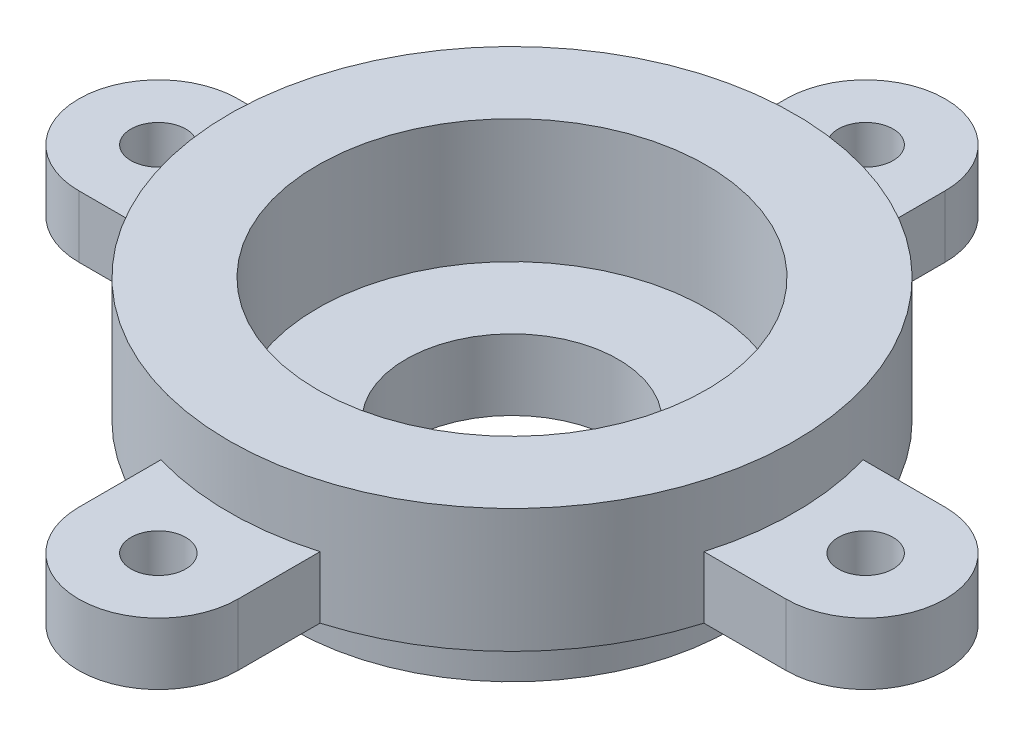
ISO-10303-21;
HEADER;
FILE_DESCRIPTION(('STEP AP214'),'2;1');
FILE_NAME('part.step','',(''),(''),'','','');
FILE_SCHEMA(('AUTOMOTIVE_DESIGN { 1 0 10303 214 1 1 1 1 }'));
ENDSEC;
DATA;
#1=APPLICATION_CONTEXT('core data for automotive mechanical design processes');
#2=APPLICATION_PROTOCOL_DEFINITION('international standard','automotive_design',2000,#1);
#3=PRODUCT_CONTEXT('',#1,'mechanical');
#4=PRODUCT('Part','Part','',(#3));
#5=PRODUCT_RELATED_PRODUCT_CATEGORY('part','',(#4));
#6=PRODUCT_DEFINITION_FORMATION('','',#4);
#7=PRODUCT_DEFINITION_CONTEXT('part definition',#1,'design');
#8=PRODUCT_DEFINITION('design','',#6,#7);
#9=PRODUCT_DEFINITION_SHAPE('','',#8);
#10=(LENGTH_UNIT() NAMED_UNIT(*) SI_UNIT(.MILLI.,.METRE.));
#11=(NAMED_UNIT(*) PLANE_ANGLE_UNIT() SI_UNIT($,.RADIAN.));
#12=(NAMED_UNIT(*) SI_UNIT($,.STERADIAN.) SOLID_ANGLE_UNIT());
#13=UNCERTAINTY_MEASURE_WITH_UNIT(LENGTH_MEASURE(1.E-05),#10,'distance_accuracy_value','');
#14=(GEOMETRIC_REPRESENTATION_CONTEXT(3) GLOBAL_UNCERTAINTY_ASSIGNED_CONTEXT((#13)) GLOBAL_UNIT_ASSIGNED_CONTEXT((#10,
#11,#12)) REPRESENTATION_CONTEXT('',''));
#15=CARTESIAN_POINT('',(0.,0.,0.));
#16=DIRECTION('',(0.,0.,1.));
#17=DIRECTION('',(1.,0.,0.));
#18=AXIS2_PLACEMENT_3D('',#15,#16,#17);
#19=CARTESIAN_POINT('',(0.,11.,0.));
#20=DIRECTION('',(0.,-1.,0.));
#21=DIRECTION('',(0.,0.,-1.));
#22=AXIS2_PLACEMENT_3D('',#19,#20,#21);
#23=CYLINDRICAL_SURFACE('',#22,16.);
#24=CARTESIAN_POINT('',(0.,11.,0.));
#25=DIRECTION('',(0.,1.,0.));
#26=DIRECTION('',(0.,0.,1.));
#27=AXIS2_PLACEMENT_3D('',#24,#25,#26);
#28=CIRCLE('',#27,16.);
#29=CARTESIAN_POINT('',(0.,11.,16.));
#30=VERTEX_POINT('',#29);
#31=EDGE_CURVE('E287',#30,#30,#28,.T.);
#32=ORIENTED_EDGE('',*,*,#31,.F.);
#33=EDGE_LOOP('',(#32));
#34=FACE_BOUND('',#33,.T.);
#35=DIRECTION('',(0.,-1.,0.));
#36=VECTOR('',#35,1.);
#37=CARTESIAN_POINT('',(-15.354152532784,7.5,-4.50000000000016));
#38=LINE('',#37,#36);
#39=CARTESIAN_POINT('',(-15.354152532784,7.5,-4.50000000000016));
#40=VERTEX_POINT('',#39);
#41=CARTESIAN_POINT('',(-15.354152532784,4.,-4.50000000000016));
#42=VERTEX_POINT('',#41);
#43=EDGE_CURVE('E47',#40,#42,#38,.T.);
#44=ORIENTED_EDGE('',*,*,#43,.F.);
#45=CARTESIAN_POINT('',(0.,7.5,0.));
#46=DIRECTION('',(0.,1.,0.));
#47=DIRECTION('',(0.,0.,1.));
#48=AXIS2_PLACEMENT_3D('',#45,#46,#47);
#49=CIRCLE('',#48,16.);
#50=CARTESIAN_POINT('',(-15.3541525327841,7.5,4.49999999999984));
#51=VERTEX_POINT('',#50);
#52=EDGE_CURVE('E52',#40,#51,#49,.T.);
#53=ORIENTED_EDGE('',*,*,#52,.T.);
#54=DIRECTION('',(0.,-1.,0.));
#55=VECTOR('',#54,1.);
#56=CARTESIAN_POINT('',(-15.3541525327841,7.5,4.49999999999984));
#57=LINE('',#56,#55);
#58=CARTESIAN_POINT('',(-15.3541525327841,4.,4.49999999999984));
#59=VERTEX_POINT('',#58);
#60=EDGE_CURVE('E165',#51,#59,#57,.T.);
#61=ORIENTED_EDGE('',*,*,#60,.T.);
#62=CARTESIAN_POINT('',(0.,4.,0.));
#63=DIRECTION('',(0.,1.,0.));
#64=DIRECTION('',(0.,0.,1.));
#65=AXIS2_PLACEMENT_3D('',#62,#63,#64);
#66=CIRCLE('',#65,16.);
#67=CARTESIAN_POINT('',(-4.5,4.,15.3541525327841));
#68=VERTEX_POINT('',#67);
#69=EDGE_CURVE('E293',#59,#68,#66,.T.);
#70=ORIENTED_EDGE('',*,*,#69,.T.);
#71=DIRECTION('',(0.,-1.,0.));
#72=VECTOR('',#71,1.);
#73=CARTESIAN_POINT('',(-4.5,7.5,15.3541525327841));
#74=LINE('',#73,#72);
#75=CARTESIAN_POINT('',(-4.5,7.5,15.3541525327841));
#76=VERTEX_POINT('',#75);
#77=EDGE_CURVE('E205',#76,#68,#74,.T.);
#78=ORIENTED_EDGE('',*,*,#77,.F.);
#79=CARTESIAN_POINT('',(0.,7.5,0.));
#80=DIRECTION('',(0.,1.,0.));
#81=DIRECTION('',(0.,0.,1.));
#82=AXIS2_PLACEMENT_3D('',#79,#80,#81);
#83=CIRCLE('',#82,16.);
#84=CARTESIAN_POINT('',(4.5,7.5,15.3541525327841));
#85=VERTEX_POINT('',#84);
#86=EDGE_CURVE('E189',#76,#85,#83,.T.);
#87=ORIENTED_EDGE('',*,*,#86,.T.);
#88=DIRECTION('',(0.,-1.,0.));
#89=VECTOR('',#88,1.);
#90=CARTESIAN_POINT('',(4.5,7.5,15.3541525327841));
#91=LINE('',#90,#89);
#92=CARTESIAN_POINT('',(4.5,4.,15.3541525327841));
#93=VERTEX_POINT('',#92);
#94=EDGE_CURVE('E199',#85,#93,#91,.T.);
#95=ORIENTED_EDGE('',*,*,#94,.T.);
#96=CARTESIAN_POINT('',(15.3541525327841,4.,4.50000000000005));
#97=VERTEX_POINT('',#96);
#98=EDGE_CURVE('E604',#93,#97,#66,.T.);
#99=ORIENTED_EDGE('',*,*,#98,.T.);
#100=DIRECTION('',(0.,-1.,0.));
#101=VECTOR('',#100,1.);
#102=CARTESIAN_POINT('',(15.3541525327841,7.5,4.50000000000005));
#103=LINE('',#102,#101);
#104=CARTESIAN_POINT('',(15.3541525327841,7.5,4.50000000000005));
#105=VERTEX_POINT('',#104);
#106=EDGE_CURVE('E239',#105,#97,#103,.T.);
#107=ORIENTED_EDGE('',*,*,#106,.F.);
#108=CARTESIAN_POINT('',(0.,7.5,0.));
#109=DIRECTION('',(0.,1.,0.));
#110=DIRECTION('',(0.,0.,1.));
#111=AXIS2_PLACEMENT_3D('',#108,#109,#110);
#112=CIRCLE('',#111,16.);
#113=CARTESIAN_POINT('',(15.3541525327841,7.5,-4.49999999999995));
#114=VERTEX_POINT('',#113);
#115=EDGE_CURVE('E223',#105,#114,#112,.T.);
#116=ORIENTED_EDGE('',*,*,#115,.T.);
#117=DIRECTION('',(0.,-1.,0.));
#118=VECTOR('',#117,1.);
#119=CARTESIAN_POINT('',(15.3541525327841,7.5,-4.49999999999995));
#120=LINE('',#119,#118);
#121=CARTESIAN_POINT('',(15.3541525327841,4.,-4.49999999999995));
#122=VERTEX_POINT('',#121);
#123=EDGE_CURVE('E233',#114,#122,#120,.T.);
#124=ORIENTED_EDGE('',*,*,#123,.T.);
#125=CARTESIAN_POINT('',(4.5,4.,-15.3541525327841));
#126=VERTEX_POINT('',#125);
#127=EDGE_CURVE('E286',#122,#126,#66,.T.);
#128=ORIENTED_EDGE('',*,*,#127,.T.);
#129=DIRECTION('',(0.,-1.,0.));
#130=VECTOR('',#129,1.);
#131=CARTESIAN_POINT('',(4.5,7.5,-15.3541525327841));
#132=LINE('',#131,#130);
#133=CARTESIAN_POINT('',(4.5,7.5,-15.3541525327841));
#134=VERTEX_POINT('',#133);
#135=EDGE_CURVE('E273',#134,#126,#132,.T.);
#136=ORIENTED_EDGE('',*,*,#135,.F.);
#137=CARTESIAN_POINT('',(0.,7.5,0.));
#138=DIRECTION('',(0.,1.,0.));
#139=DIRECTION('',(0.,0.,1.));
#140=AXIS2_PLACEMENT_3D('',#137,#138,#139);
#141=CIRCLE('',#140,16.);
#142=CARTESIAN_POINT('',(-4.5,7.5,-15.3541525327841));
#143=VERTEX_POINT('',#142);
#144=EDGE_CURVE('E257',#134,#143,#141,.T.);
#145=ORIENTED_EDGE('',*,*,#144,.T.);
#146=DIRECTION('',(0.,-1.,0.));
#147=VECTOR('',#146,1.);
#148=CARTESIAN_POINT('',(-4.5,7.5,-15.3541525327841));
#149=LINE('',#148,#147);
#150=CARTESIAN_POINT('',(-4.5,4.,-15.3541525327841));
#151=VERTEX_POINT('',#150);
#152=EDGE_CURVE('E267',#143,#151,#149,.T.);
#153=ORIENTED_EDGE('',*,*,#152,.T.);
#154=EDGE_CURVE('E291',#151,#42,#66,.T.);
#155=ORIENTED_EDGE('',*,*,#154,.T.);
#156=EDGE_LOOP('',(#44,#53,#61,#70,#78,#87,#95,#99,#107,#116,#124,#128,#136,#145,#153,#155));
#157=FACE_BOUND('',#156,.T.);
#158=ADVANCED_FACE('F32',(#34,#157),#23,.T.);
#159=CARTESIAN_POINT('',(0.,4.,0.));
#160=DIRECTION('',(0.,1.,0.));
#161=DIRECTION('',(0.,0.,1.));
#162=AXIS2_PLACEMENT_3D('',#159,#160,#161);
#163=PLANE('',#162);
#164=CARTESIAN_POINT('',(0.,4.,0.));
#165=DIRECTION('',(0.,1.,0.));
#166=DIRECTION('',(0.,0.,1.));
#167=AXIS2_PLACEMENT_3D('',#164,#165,#166);
#168=CIRCLE('',#167,6.);
#169=CARTESIAN_POINT('',(0.,4.,6.));
#170=VERTEX_POINT('',#169);
#171=EDGE_CURVE('E294',#170,#170,#168,.T.);
#172=ORIENTED_EDGE('',*,*,#171,.F.);
#173=EDGE_LOOP('',(#172));
#174=FACE_BOUND('',#173,.T.);
#175=CARTESIAN_POINT('',(0.,4.,0.));
#176=DIRECTION('',(0.,1.,0.));
#177=DIRECTION('',(0.,0.,1.));
#178=AXIS2_PLACEMENT_3D('',#175,#176,#177);
#179=CIRCLE('',#178,11.);
#180=CARTESIAN_POINT('',(0.,4.,11.));
#181=VERTEX_POINT('',#180);
#182=EDGE_CURVE('E11',#181,#181,#179,.F.);
#183=ORIENTED_EDGE('',*,*,#182,.F.);
#184=EDGE_LOOP('',(#183));
#185=FACE_BOUND('',#184,.T.);
#186=ADVANCED_FACE('F308',(#174,#185),#163,.T.);
#187=CARTESIAN_POINT('',(0.,0.,0.));
#188=DIRECTION('',(0.,1.,0.));
#189=DIRECTION('',(0.,0.,1.));
#190=AXIS2_PLACEMENT_3D('',#187,#188,#189);
#191=PLANE('',#190);
#192=CARTESIAN_POINT('',(0.,0.,0.));
#193=DIRECTION('',(0.,1.,0.));
#194=DIRECTION('',(0.,0.,1.));
#195=AXIS2_PLACEMENT_3D('',#192,#193,#194);
#196=CIRCLE('',#195,12.45);
#197=CARTESIAN_POINT('',(0.,0.,12.45));
#198=VERTEX_POINT('',#197);
#199=EDGE_CURVE('E297',#198,#198,#196,.T.);
#200=ORIENTED_EDGE('',*,*,#199,.F.);
#201=EDGE_LOOP('',(#200));
#202=FACE_BOUND('',#201,.T.);
#203=CARTESIAN_POINT('',(0.,0.,0.));
#204=DIRECTION('',(0.,1.,0.));
#205=DIRECTION('',(0.,0.,1.));
#206=AXIS2_PLACEMENT_3D('',#203,#204,#205);
#207=CIRCLE('',#206,6.);
#208=CARTESIAN_POINT('',(0.,0.,6.));
#209=VERTEX_POINT('',#208);
#210=EDGE_CURVE('E290',#209,#209,#207,.T.);
#211=ORIENTED_EDGE('',*,*,#210,.T.);
#212=EDGE_LOOP('',(#211));
#213=FACE_BOUND('',#212,.T.);
#214=ADVANCED_FACE('F305',(#202,#213),#191,.F.);
#215=CARTESIAN_POINT('',(0.,4.,0.));
#216=DIRECTION('',(0.,-1.,0.));
#217=DIRECTION('',(0.,0.,-1.));
#218=AXIS2_PLACEMENT_3D('',#215,#216,#217);
#219=CYLINDRICAL_SURFACE('',#218,12.45);
#220=CARTESIAN_POINT('',(0.,4.,0.));
#221=DIRECTION('',(0.,1.,0.));
#222=DIRECTION('',(0.,0.,1.));
#223=AXIS2_PLACEMENT_3D('',#220,#221,#222);
#224=CIRCLE('',#223,12.45);
#225=CARTESIAN_POINT('',(0.,4.,12.45));
#226=VERTEX_POINT('',#225);
#227=EDGE_CURVE('E40',#226,#226,#224,.T.);
#228=ORIENTED_EDGE('',*,*,#227,.F.);
#229=EDGE_LOOP('',(#228));
#230=FACE_BOUND('',#229,.T.);
#231=ORIENTED_EDGE('',*,*,#199,.T.);
#232=EDGE_LOOP('',(#231));
#233=FACE_BOUND('',#232,.T.);
#234=ADVANCED_FACE('F34',(#230,#233),#219,.T.);
#235=CARTESIAN_POINT('',(0.,4.,0.));
#236=DIRECTION('',(0.,-1.,0.));
#237=DIRECTION('',(0.,0.,-1.));
#238=AXIS2_PLACEMENT_3D('',#235,#236,#237);
#239=CYLINDRICAL_SURFACE('',#238,6.);
#240=ORIENTED_EDGE('',*,*,#171,.T.);
#241=EDGE_LOOP('',(#240));
#242=FACE_BOUND('',#241,.T.);
#243=ORIENTED_EDGE('',*,*,#210,.F.);
#244=EDGE_LOOP('',(#243));
#245=FACE_BOUND('',#244,.T.);
#246=ADVANCED_FACE('F311',(#242,#245),#239,.F.);
#247=CARTESIAN_POINT('',(0.,11.,0.));
#248=DIRECTION('',(0.,1.,0.));
#249=DIRECTION('',(0.,0.,1.));
#250=AXIS2_PLACEMENT_3D('',#247,#248,#249);
#251=PLANE('',#250);
#252=ORIENTED_EDGE('',*,*,#31,.T.);
#253=EDGE_LOOP('',(#252));
#254=FACE_BOUND('',#253,.T.);
#255=CARTESIAN_POINT('',(0.,11.,0.));
#256=DIRECTION('',(0.,1.,0.));
#257=DIRECTION('',(0.,0.,1.));
#258=AXIS2_PLACEMENT_3D('',#255,#256,#257);
#259=CIRCLE('',#258,11.);
#260=CARTESIAN_POINT('',(0.,11.,11.));
#261=VERTEX_POINT('',#260);
#262=EDGE_CURVE('E276',#261,#261,#259,.T.);
#263=ORIENTED_EDGE('',*,*,#262,.F.);
#264=EDGE_LOOP('',(#263));
#265=FACE_BOUND('',#264,.T.);
#266=ADVANCED_FACE('F313',(#254,#265),#251,.T.);
#267=CARTESIAN_POINT('',(0.,4.,0.));
#268=DIRECTION('',(0.,1.,0.));
#269=DIRECTION('',(0.,0.,1.));
#270=AXIS2_PLACEMENT_3D('',#267,#268,#269);
#271=PLANE('',#270);
#272=ORIENTED_EDGE('',*,*,#227,.T.);
#273=EDGE_LOOP('',(#272));
#274=FACE_BOUND('',#273,.T.);
#275=ORIENTED_EDGE('',*,*,#154,.F.);
#276=DIRECTION('',(0.,0.,1.));
#277=VECTOR('',#276,1.);
#278=CARTESIAN_POINT('',(-4.5,4.,0.));
#279=LINE('',#278,#277);
#280=CARTESIAN_POINT('',(-4.5,4.,-20.));
#281=VERTEX_POINT('',#280);
#282=EDGE_CURVE('E254',#281,#151,#279,.T.);
#283=ORIENTED_EDGE('',*,*,#282,.F.);
#284=CARTESIAN_POINT('',(0.,4.,-20.));
#285=DIRECTION('',(0.,1.,0.));
#286=DIRECTION('',(0.,0.,1.));
#287=AXIS2_PLACEMENT_3D('',#284,#285,#286);
#288=CIRCLE('',#287,4.5);
#289=CARTESIAN_POINT('',(4.5,4.,-20.));
#290=VERTEX_POINT('',#289);
#291=EDGE_CURVE('E270',#290,#281,#288,.T.);
#292=ORIENTED_EDGE('',*,*,#291,.F.);
#293=DIRECTION('',(0.,0.,-1.));
#294=VECTOR('',#293,1.);
#295=CARTESIAN_POINT('',(4.5,4.,0.));
#296=LINE('',#295,#294);
#297=EDGE_CURVE('E260',#126,#290,#296,.T.);
#298=ORIENTED_EDGE('',*,*,#297,.F.);
#299=ORIENTED_EDGE('',*,*,#127,.F.);
#300=DIRECTION('',(-1.,0.,0.));
#301=VECTOR('',#300,1.);
#302=CARTESIAN_POINT('',(0.,4.,-4.5));
#303=LINE('',#302,#301);
#304=CARTESIAN_POINT('',(20.,4.,-4.49999999999993));
#305=VERTEX_POINT('',#304);
#306=EDGE_CURVE('E220',#305,#122,#303,.T.);
#307=ORIENTED_EDGE('',*,*,#306,.F.);
#308=CARTESIAN_POINT('',(20.,4.,0.));
#309=DIRECTION('',(0.,1.,0.));
#310=DIRECTION('',(0.,0.,1.));
#311=AXIS2_PLACEMENT_3D('',#308,#309,#310);
#312=CIRCLE('',#311,4.5);
#313=CARTESIAN_POINT('',(20.,4.,4.50000000000007));
#314=VERTEX_POINT('',#313);
#315=EDGE_CURVE('E236',#314,#305,#312,.T.);
#316=ORIENTED_EDGE('',*,*,#315,.F.);
#317=DIRECTION('',(1.,0.,0.));
#318=VECTOR('',#317,1.);
#319=CARTESIAN_POINT('',(0.,4.,4.5));
#320=LINE('',#319,#318);
#321=EDGE_CURVE('E226',#97,#314,#320,.T.);
#322=ORIENTED_EDGE('',*,*,#321,.F.);
#323=ORIENTED_EDGE('',*,*,#98,.F.);
#324=DIRECTION('',(0.,0.,-1.));
#325=VECTOR('',#324,1.);
#326=CARTESIAN_POINT('',(4.5,4.,0.));
#327=LINE('',#326,#325);
#328=CARTESIAN_POINT('',(4.5,4.,20.));
#329=VERTEX_POINT('',#328);
#330=EDGE_CURVE('E186',#329,#93,#327,.T.);
#331=ORIENTED_EDGE('',*,*,#330,.F.);
#332=CARTESIAN_POINT('',(0.,4.,20.));
#333=DIRECTION('',(0.,1.,0.));
#334=DIRECTION('',(0.,0.,1.));
#335=AXIS2_PLACEMENT_3D('',#332,#333,#334);
#336=CIRCLE('',#335,4.5);
#337=CARTESIAN_POINT('',(-4.5,4.,20.));
#338=VERTEX_POINT('',#337);
#339=EDGE_CURVE('E202',#338,#329,#336,.T.);
#340=ORIENTED_EDGE('',*,*,#339,.F.);
#341=DIRECTION('',(0.,0.,1.));
#342=VECTOR('',#341,1.);
#343=CARTESIAN_POINT('',(-4.5,4.,0.));
#344=LINE('',#343,#342);
#345=EDGE_CURVE('E192',#68,#338,#344,.T.);
#346=ORIENTED_EDGE('',*,*,#345,.F.);
#347=ORIENTED_EDGE('',*,*,#69,.F.);
#348=DIRECTION('',(1.,0.,0.));
#349=VECTOR('',#348,1.);
#350=CARTESIAN_POINT('',(0.,4.,4.5));
#351=LINE('',#350,#349);
#352=CARTESIAN_POINT('',(-20.,4.,4.49999999999979));
#353=VERTEX_POINT('',#352);
#354=EDGE_CURVE('E174',#353,#59,#351,.T.);
#355=ORIENTED_EDGE('',*,*,#354,.F.);
#356=CARTESIAN_POINT('',(-20.,4.,-2.09488880330588E-13));
#357=DIRECTION('',(0.,1.,0.));
#358=DIRECTION('',(0.,0.,1.));
#359=AXIS2_PLACEMENT_3D('',#356,#357,#358);
#360=CIRCLE('',#359,4.5);
#361=CARTESIAN_POINT('',(-20.,4.,-4.50000000000021));
#362=VERTEX_POINT('',#361);
#363=EDGE_CURVE('E160',#362,#353,#360,.T.);
#364=ORIENTED_EDGE('',*,*,#363,.F.);
#365=DIRECTION('',(-1.,0.,0.));
#366=VECTOR('',#365,1.);
#367=CARTESIAN_POINT('',(0.,4.,-4.5));
#368=LINE('',#367,#366);
#369=EDGE_CURVE('E169',#42,#362,#368,.T.);
#370=ORIENTED_EDGE('',*,*,#369,.F.);
#371=EDGE_LOOP('',(#275,#283,#292,#298,#299,#307,#316,#322,#323,#331,#340,#346,#347,#355,#364,#370));
#372=FACE_BOUND('',#371,.T.);
#373=CARTESIAN_POINT('',(0.,4.,-20.));
#374=DIRECTION('',(0.,1.,0.));
#375=DIRECTION('',(0.,0.,1.));
#376=AXIS2_PLACEMENT_3D('',#373,#374,#375);
#377=CIRCLE('',#376,1.55);
#378=CARTESIAN_POINT('',(0.,4.,-18.45));
#379=VERTEX_POINT('',#378);
#380=EDGE_CURVE('E242',#379,#379,#377,.T.);
#381=ORIENTED_EDGE('',*,*,#380,.T.);
#382=EDGE_LOOP('',(#381));
#383=FACE_BOUND('',#382,.T.);
#384=CARTESIAN_POINT('',(20.,4.,0.));
#385=DIRECTION('',(0.,1.,0.));
#386=DIRECTION('',(0.,0.,1.));
#387=AXIS2_PLACEMENT_3D('',#384,#385,#386);
#388=CIRCLE('',#387,1.55);
#389=CARTESIAN_POINT('',(20.,4.,1.55000000000007));
#390=VERTEX_POINT('',#389);
#391=EDGE_CURVE('E208',#390,#390,#388,.T.);
#392=ORIENTED_EDGE('',*,*,#391,.T.);
#393=EDGE_LOOP('',(#392));
#394=FACE_BOUND('',#393,.T.);
#395=CARTESIAN_POINT('',(0.,4.,20.));
#396=DIRECTION('',(0.,1.,0.));
#397=DIRECTION('',(0.,0.,1.));
#398=AXIS2_PLACEMENT_3D('',#395,#396,#397);
#399=CIRCLE('',#398,1.55);
#400=CARTESIAN_POINT('',(0.,4.,21.55));
#401=VERTEX_POINT('',#400);
#402=EDGE_CURVE('E180',#401,#401,#399,.T.);
#403=ORIENTED_EDGE('',*,*,#402,.T.);
#404=EDGE_LOOP('',(#403));
#405=FACE_BOUND('',#404,.T.);
#406=CARTESIAN_POINT('',(-20.,4.,-2.09488880330588E-13));
#407=DIRECTION('',(0.,1.,0.));
#408=DIRECTION('',(0.,0.,1.));
#409=AXIS2_PLACEMENT_3D('',#406,#407,#408);
#410=CIRCLE('',#409,1.55);
#411=CARTESIAN_POINT('',(-20.,4.,1.54999999999979));
#412=VERTEX_POINT('',#411);
#413=EDGE_CURVE('E421',#412,#412,#410,.T.);
#414=ORIENTED_EDGE('',*,*,#413,.T.);
#415=EDGE_LOOP('',(#414));
#416=FACE_BOUND('',#415,.T.);
#417=ADVANCED_FACE('F320',(#274,#372,#383,#394,#405,#416),#271,.F.);
#418=CARTESIAN_POINT('',(0.,11.,0.));
#419=DIRECTION('',(0.,-1.,0.));
#420=DIRECTION('',(0.,0.,-1.));
#421=AXIS2_PLACEMENT_3D('',#418,#419,#420);
#422=CYLINDRICAL_SURFACE('',#421,11.);
#423=ORIENTED_EDGE('',*,*,#262,.T.);
#424=EDGE_LOOP('',(#423));
#425=FACE_BOUND('',#424,.T.);
#426=ORIENTED_EDGE('',*,*,#182,.T.);
#427=EDGE_LOOP('',(#426));
#428=FACE_BOUND('',#427,.T.);
#429=ADVANCED_FACE('F335',(#425,#428),#422,.F.);
#430=CARTESIAN_POINT('',(0.,7.5,0.));
#431=DIRECTION('',(0.,1.,0.));
#432=DIRECTION('',(0.,0.,1.));
#433=AXIS2_PLACEMENT_3D('',#430,#431,#432);
#434=PLANE('',#433);
#435=ORIENTED_EDGE('',*,*,#144,.F.);
#436=DIRECTION('',(0.,0.,-1.));
#437=VECTOR('',#436,1.);
#438=CARTESIAN_POINT('',(4.5,7.5,0.));
#439=LINE('',#438,#437);
#440=CARTESIAN_POINT('',(4.5,7.5,-20.));
#441=VERTEX_POINT('',#440);
#442=EDGE_CURVE('E265',#134,#441,#439,.T.);
#443=ORIENTED_EDGE('',*,*,#442,.T.);
#444=CARTESIAN_POINT('',(0.,7.5,-20.));
#445=DIRECTION('',(0.,1.,0.));
#446=DIRECTION('',(0.,0.,1.));
#447=AXIS2_PLACEMENT_3D('',#444,#445,#446);
#448=CIRCLE('',#447,4.5);
#449=CARTESIAN_POINT('',(-4.5,7.5,-20.));
#450=VERTEX_POINT('',#449);
#451=EDGE_CURVE('E263',#441,#450,#448,.T.);
#452=ORIENTED_EDGE('',*,*,#451,.T.);
#453=DIRECTION('',(0.,0.,1.));
#454=VECTOR('',#453,1.);
#455=CARTESIAN_POINT('',(-4.5,7.5,0.));
#456=LINE('',#455,#454);
#457=EDGE_CURVE('E259',#450,#143,#456,.T.);
#458=ORIENTED_EDGE('',*,*,#457,.T.);
#459=EDGE_LOOP('',(#435,#443,#452,#458));
#460=FACE_BOUND('',#459,.T.);
#461=CARTESIAN_POINT('',(0.,7.5,-20.));
#462=DIRECTION('',(0.,1.,0.));
#463=DIRECTION('',(0.,0.,1.));
#464=AXIS2_PLACEMENT_3D('',#461,#462,#463);
#465=CIRCLE('',#464,1.55);
#466=CARTESIAN_POINT('',(0.,7.5,-18.45));
#467=VERTEX_POINT('',#466);
#468=EDGE_CURVE('E251',#467,#467,#465,.T.);
#469=ORIENTED_EDGE('',*,*,#468,.F.);
#470=EDGE_LOOP('',(#469));
#471=FACE_BOUND('',#470,.T.);
#472=ADVANCED_FACE('F340',(#460,#471),#434,.T.);
#473=CARTESIAN_POINT('',(4.5,7.5,0.));
#474=DIRECTION('',(-1.,0.,0.));
#475=DIRECTION('',(0.,0.,1.));
#476=AXIS2_PLACEMENT_3D('',#473,#474,#475);
#477=PLANE('',#476);
#478=ORIENTED_EDGE('',*,*,#297,.T.);
#479=DIRECTION('',(0.,-1.,0.));
#480=VECTOR('',#479,1.);
#481=CARTESIAN_POINT('',(4.5,7.5,-20.));
#482=LINE('',#481,#480);
#483=EDGE_CURVE('E277',#441,#290,#482,.T.);
#484=ORIENTED_EDGE('',*,*,#483,.F.);
#485=ORIENTED_EDGE('',*,*,#442,.F.);
#486=ORIENTED_EDGE('',*,*,#135,.T.);
#487=EDGE_LOOP('',(#478,#484,#485,#486));
#488=FACE_BOUND('',#487,.T.);
#489=ADVANCED_FACE('F350',(#488),#477,.F.);
#490=CARTESIAN_POINT('',(0.,7.5,-20.));
#491=DIRECTION('',(0.,-1.,0.));
#492=DIRECTION('',(0.,0.,-1.));
#493=AXIS2_PLACEMENT_3D('',#490,#491,#492);
#494=CYLINDRICAL_SURFACE('',#493,4.5);
#495=ORIENTED_EDGE('',*,*,#291,.T.);
#496=DIRECTION('',(0.,-1.,0.));
#497=VECTOR('',#496,1.);
#498=CARTESIAN_POINT('',(-4.5,7.5,-20.));
#499=LINE('',#498,#497);
#500=EDGE_CURVE('E280',#450,#281,#499,.T.);
#501=ORIENTED_EDGE('',*,*,#500,.F.);
#502=ORIENTED_EDGE('',*,*,#451,.F.);
#503=ORIENTED_EDGE('',*,*,#483,.T.);
#504=EDGE_LOOP('',(#495,#501,#502,#503));
#505=FACE_BOUND('',#504,.T.);
#506=ADVANCED_FACE('F346',(#505),#494,.T.);
#507=CARTESIAN_POINT('',(-4.5,7.5,0.));
#508=DIRECTION('',(1.,0.,0.));
#509=DIRECTION('',(0.,0.,-1.));
#510=AXIS2_PLACEMENT_3D('',#507,#508,#509);
#511=PLANE('',#510);
#512=ORIENTED_EDGE('',*,*,#282,.T.);
#513=ORIENTED_EDGE('',*,*,#152,.F.);
#514=ORIENTED_EDGE('',*,*,#457,.F.);
#515=ORIENTED_EDGE('',*,*,#500,.T.);
#516=EDGE_LOOP('',(#512,#513,#514,#515));
#517=FACE_BOUND('',#516,.T.);
#518=ADVANCED_FACE('F342',(#517),#511,.F.);
#519=CARTESIAN_POINT('',(0.,7.5,-20.));
#520=DIRECTION('',(0.,-1.,0.));
#521=DIRECTION('',(0.,0.,-1.));
#522=AXIS2_PLACEMENT_3D('',#519,#520,#521);
#523=CYLINDRICAL_SURFACE('',#522,1.55);
#524=ORIENTED_EDGE('',*,*,#468,.T.);
#525=EDGE_LOOP('',(#524));
#526=FACE_BOUND('',#525,.T.);
#527=ORIENTED_EDGE('',*,*,#380,.F.);
#528=EDGE_LOOP('',(#527));
#529=FACE_BOUND('',#528,.T.);
#530=ADVANCED_FACE('F345',(#526,#529),#523,.F.);
#531=CARTESIAN_POINT('',(0.,7.5,0.));
#532=DIRECTION('',(0.,1.,0.));
#533=DIRECTION('',(0.,0.,1.));
#534=AXIS2_PLACEMENT_3D('',#531,#532,#533);
#535=PLANE('',#534);
#536=ORIENTED_EDGE('',*,*,#115,.F.);
#537=DIRECTION('',(1.,0.,0.));
#538=VECTOR('',#537,1.);
#539=CARTESIAN_POINT('',(0.,7.5,4.5));
#540=LINE('',#539,#538);
#541=CARTESIAN_POINT('',(20.,7.5,4.50000000000007));
#542=VERTEX_POINT('',#541);
#543=EDGE_CURVE('E231',#105,#542,#540,.T.);
#544=ORIENTED_EDGE('',*,*,#543,.T.);
#545=CARTESIAN_POINT('',(20.,7.5,0.));
#546=DIRECTION('',(0.,1.,0.));
#547=DIRECTION('',(0.,0.,1.));
#548=AXIS2_PLACEMENT_3D('',#545,#546,#547);
#549=CIRCLE('',#548,4.5);
#550=CARTESIAN_POINT('',(20.,7.5,-4.49999999999993));
#551=VERTEX_POINT('',#550);
#552=EDGE_CURVE('E229',#542,#551,#549,.T.);
#553=ORIENTED_EDGE('',*,*,#552,.T.);
#554=DIRECTION('',(-1.,0.,0.));
#555=VECTOR('',#554,1.);
#556=CARTESIAN_POINT('',(0.,7.5,-4.5));
#557=LINE('',#556,#555);
#558=EDGE_CURVE('E225',#551,#114,#557,.T.);
#559=ORIENTED_EDGE('',*,*,#558,.T.);
#560=EDGE_LOOP('',(#536,#544,#553,#559));
#561=FACE_BOUND('',#560,.T.);
#562=CARTESIAN_POINT('',(20.,7.5,0.));
#563=DIRECTION('',(0.,1.,0.));
#564=DIRECTION('',(0.,0.,1.));
#565=AXIS2_PLACEMENT_3D('',#562,#563,#564);
#566=CIRCLE('',#565,1.55);
#567=CARTESIAN_POINT('',(20.,7.5,1.55000000000007));
#568=VERTEX_POINT('',#567);
#569=EDGE_CURVE('E217',#568,#568,#566,.T.);
#570=ORIENTED_EDGE('',*,*,#569,.F.);
#571=EDGE_LOOP('',(#570));
#572=FACE_BOUND('',#571,.T.);
#573=ADVANCED_FACE('F360',(#561,#572),#535,.T.);
#574=CARTESIAN_POINT('',(0.,7.5,4.5));
#575=DIRECTION('',(0.,0.,-1.));
#576=DIRECTION('',(-1.,0.,0.));
#577=AXIS2_PLACEMENT_3D('',#574,#575,#576);
#578=PLANE('',#577);
#579=ORIENTED_EDGE('',*,*,#321,.T.);
#580=DIRECTION('',(0.,-1.,0.));
#581=VECTOR('',#580,1.);
#582=CARTESIAN_POINT('',(20.,7.5,4.50000000000007));
#583=LINE('',#582,#581);
#584=EDGE_CURVE('E243',#542,#314,#583,.T.);
#585=ORIENTED_EDGE('',*,*,#584,.F.);
#586=ORIENTED_EDGE('',*,*,#543,.F.);
#587=ORIENTED_EDGE('',*,*,#106,.T.);
#588=EDGE_LOOP('',(#579,#585,#586,#587));
#589=FACE_BOUND('',#588,.T.);
#590=ADVANCED_FACE('F370',(#589),#578,.F.);
#591=CARTESIAN_POINT('',(20.,7.5,0.));
#592=DIRECTION('',(0.,-1.,0.));
#593=DIRECTION('',(0.,0.,-1.));
#594=AXIS2_PLACEMENT_3D('',#591,#592,#593);
#595=CYLINDRICAL_SURFACE('',#594,4.5);
#596=ORIENTED_EDGE('',*,*,#315,.T.);
#597=DIRECTION('',(0.,-1.,0.));
#598=VECTOR('',#597,1.);
#599=CARTESIAN_POINT('',(20.,7.5,-4.49999999999993));
#600=LINE('',#599,#598);
#601=EDGE_CURVE('E246',#551,#305,#600,.T.);
#602=ORIENTED_EDGE('',*,*,#601,.F.);
#603=ORIENTED_EDGE('',*,*,#552,.F.);
#604=ORIENTED_EDGE('',*,*,#584,.T.);
#605=EDGE_LOOP('',(#596,#602,#603,#604));
#606=FACE_BOUND('',#605,.T.);
#607=ADVANCED_FACE('F366',(#606),#595,.T.);
#608=CARTESIAN_POINT('',(0.,7.5,-4.5));
#609=DIRECTION('',(0.,0.,1.));
#610=DIRECTION('',(1.,0.,0.));
#611=AXIS2_PLACEMENT_3D('',#608,#609,#610);
#612=PLANE('',#611);
#613=ORIENTED_EDGE('',*,*,#306,.T.);
#614=ORIENTED_EDGE('',*,*,#123,.F.);
#615=ORIENTED_EDGE('',*,*,#558,.F.);
#616=ORIENTED_EDGE('',*,*,#601,.T.);
#617=EDGE_LOOP('',(#613,#614,#615,#616));
#618=FACE_BOUND('',#617,.T.);
#619=ADVANCED_FACE('F362',(#618),#612,.F.);
#620=CARTESIAN_POINT('',(20.,7.5,0.));
#621=DIRECTION('',(0.,-1.,0.));
#622=DIRECTION('',(0.,0.,-1.));
#623=AXIS2_PLACEMENT_3D('',#620,#621,#622);
#624=CYLINDRICAL_SURFACE('',#623,1.55);
#625=ORIENTED_EDGE('',*,*,#569,.T.);
#626=EDGE_LOOP('',(#625));
#627=FACE_BOUND('',#626,.T.);
#628=ORIENTED_EDGE('',*,*,#391,.F.);
#629=EDGE_LOOP('',(#628));
#630=FACE_BOUND('',#629,.T.);
#631=ADVANCED_FACE('F365',(#627,#630),#624,.F.);
#632=CARTESIAN_POINT('',(0.,7.5,0.));
#633=DIRECTION('',(0.,1.,0.));
#634=DIRECTION('',(0.,0.,1.));
#635=AXIS2_PLACEMENT_3D('',#632,#633,#634);
#636=PLANE('',#635);
#637=ORIENTED_EDGE('',*,*,#86,.F.);
#638=DIRECTION('',(0.,0.,1.));
#639=VECTOR('',#638,1.);
#640=CARTESIAN_POINT('',(-4.5,7.5,0.));
#641=LINE('',#640,#639);
#642=CARTESIAN_POINT('',(-4.5,7.5,20.));
#643=VERTEX_POINT('',#642);
#644=EDGE_CURVE('E197',#76,#643,#641,.T.);
#645=ORIENTED_EDGE('',*,*,#644,.T.);
#646=CARTESIAN_POINT('',(0.,7.5,20.));
#647=DIRECTION('',(0.,1.,0.));
#648=DIRECTION('',(0.,0.,1.));
#649=AXIS2_PLACEMENT_3D('',#646,#647,#648);
#650=CIRCLE('',#649,4.5);
#651=CARTESIAN_POINT('',(4.5,7.5,20.));
#652=VERTEX_POINT('',#651);
#653=EDGE_CURVE('E195',#643,#652,#650,.T.);
#654=ORIENTED_EDGE('',*,*,#653,.T.);
#655=DIRECTION('',(0.,0.,-1.));
#656=VECTOR('',#655,1.);
#657=CARTESIAN_POINT('',(4.5,7.5,0.));
#658=LINE('',#657,#656);
#659=EDGE_CURVE('E191',#652,#85,#658,.T.);
#660=ORIENTED_EDGE('',*,*,#659,.T.);
#661=EDGE_LOOP('',(#637,#645,#654,#660));
#662=FACE_BOUND('',#661,.T.);
#663=CARTESIAN_POINT('',(0.,7.5,20.));
#664=DIRECTION('',(0.,1.,0.));
#665=DIRECTION('',(0.,0.,1.));
#666=AXIS2_PLACEMENT_3D('',#663,#664,#665);
#667=CIRCLE('',#666,1.55);
#668=CARTESIAN_POINT('',(0.,7.5,21.55));
#669=VERTEX_POINT('',#668);
#670=EDGE_CURVE('E183',#669,#669,#667,.T.);
#671=ORIENTED_EDGE('',*,*,#670,.F.);
#672=EDGE_LOOP('',(#671));
#673=FACE_BOUND('',#672,.T.);
#674=ADVANCED_FACE('F380',(#662,#673),#636,.T.);
#675=CARTESIAN_POINT('',(-4.5,7.5,0.));
#676=DIRECTION('',(1.,0.,0.));
#677=DIRECTION('',(0.,0.,-1.));
#678=AXIS2_PLACEMENT_3D('',#675,#676,#677);
#679=PLANE('',#678);
#680=ORIENTED_EDGE('',*,*,#345,.T.);
#681=DIRECTION('',(0.,-1.,0.));
#682=VECTOR('',#681,1.);
#683=CARTESIAN_POINT('',(-4.5,7.5,20.));
#684=LINE('',#683,#682);
#685=EDGE_CURVE('E209',#643,#338,#684,.T.);
#686=ORIENTED_EDGE('',*,*,#685,.F.);
#687=ORIENTED_EDGE('',*,*,#644,.F.);
#688=ORIENTED_EDGE('',*,*,#77,.T.);
#689=EDGE_LOOP('',(#680,#686,#687,#688));
#690=FACE_BOUND('',#689,.T.);
#691=ADVANCED_FACE('F390',(#690),#679,.F.);
#692=CARTESIAN_POINT('',(0.,7.5,20.));
#693=DIRECTION('',(0.,-1.,0.));
#694=DIRECTION('',(0.,0.,-1.));
#695=AXIS2_PLACEMENT_3D('',#692,#693,#694);
#696=CYLINDRICAL_SURFACE('',#695,4.5);
#697=ORIENTED_EDGE('',*,*,#339,.T.);
#698=DIRECTION('',(0.,-1.,0.));
#699=VECTOR('',#698,1.);
#700=CARTESIAN_POINT('',(4.5,7.5,20.));
#701=LINE('',#700,#699);
#702=EDGE_CURVE('E212',#652,#329,#701,.T.);
#703=ORIENTED_EDGE('',*,*,#702,.F.);
#704=ORIENTED_EDGE('',*,*,#653,.F.);
#705=ORIENTED_EDGE('',*,*,#685,.T.);
#706=EDGE_LOOP('',(#697,#703,#704,#705));
#707=FACE_BOUND('',#706,.T.);
#708=ADVANCED_FACE('F386',(#707),#696,.T.);
#709=CARTESIAN_POINT('',(4.5,7.5,0.));
#710=DIRECTION('',(-1.,0.,0.));
#711=DIRECTION('',(0.,0.,1.));
#712=AXIS2_PLACEMENT_3D('',#709,#710,#711);
#713=PLANE('',#712);
#714=ORIENTED_EDGE('',*,*,#330,.T.);
#715=ORIENTED_EDGE('',*,*,#94,.F.);
#716=ORIENTED_EDGE('',*,*,#659,.F.);
#717=ORIENTED_EDGE('',*,*,#702,.T.);
#718=EDGE_LOOP('',(#714,#715,#716,#717));
#719=FACE_BOUND('',#718,.T.);
#720=ADVANCED_FACE('F382',(#719),#713,.F.);
#721=CARTESIAN_POINT('',(0.,7.5,20.));
#722=DIRECTION('',(0.,-1.,0.));
#723=DIRECTION('',(0.,0.,-1.));
#724=AXIS2_PLACEMENT_3D('',#721,#722,#723);
#725=CYLINDRICAL_SURFACE('',#724,1.55);
#726=ORIENTED_EDGE('',*,*,#670,.T.);
#727=EDGE_LOOP('',(#726));
#728=FACE_BOUND('',#727,.T.);
#729=ORIENTED_EDGE('',*,*,#402,.F.);
#730=EDGE_LOOP('',(#729));
#731=FACE_BOUND('',#730,.T.);
#732=ADVANCED_FACE('F385',(#728,#731),#725,.F.);
#733=CARTESIAN_POINT('',(0.,7.5,0.));
#734=DIRECTION('',(0.,1.,0.));
#735=DIRECTION('',(0.,0.,1.));
#736=AXIS2_PLACEMENT_3D('',#733,#734,#735);
#737=PLANE('',#736);
#738=ORIENTED_EDGE('',*,*,#52,.F.);
#739=DIRECTION('',(-1.,0.,0.));
#740=VECTOR('',#739,1.);
#741=CARTESIAN_POINT('',(0.,7.5,-4.5));
#742=LINE('',#741,#740);
#743=CARTESIAN_POINT('',(-20.,7.5,-4.50000000000021));
#744=VERTEX_POINT('',#743);
#745=EDGE_CURVE('E151',#40,#744,#742,.T.);
#746=ORIENTED_EDGE('',*,*,#745,.T.);
#747=CARTESIAN_POINT('',(-20.,7.5,-2.09488880330588E-13));
#748=DIRECTION('',(0.,1.,0.));
#749=DIRECTION('',(0.,0.,1.));
#750=AXIS2_PLACEMENT_3D('',#747,#748,#749);
#751=CIRCLE('',#750,4.5);
#752=CARTESIAN_POINT('',(-20.,7.5,4.49999999999979));
#753=VERTEX_POINT('',#752);
#754=EDGE_CURVE('E144',#744,#753,#751,.T.);
#755=ORIENTED_EDGE('',*,*,#754,.T.);
#756=DIRECTION('',(1.,0.,0.));
#757=VECTOR('',#756,1.);
#758=CARTESIAN_POINT('',(0.,7.5,4.5));
#759=LINE('',#758,#757);
#760=EDGE_CURVE('E149',#753,#51,#759,.T.);
#761=ORIENTED_EDGE('',*,*,#760,.T.);
#762=EDGE_LOOP('',(#738,#746,#755,#761));
#763=FACE_BOUND('',#762,.T.);
#764=CARTESIAN_POINT('',(-20.,7.5,-2.09488880330588E-13));
#765=DIRECTION('',(0.,1.,0.));
#766=DIRECTION('',(0.,0.,1.));
#767=AXIS2_PLACEMENT_3D('',#764,#765,#766);
#768=CIRCLE('',#767,1.55);
#769=CARTESIAN_POINT('',(-20.,7.5,1.54999999999979));
#770=VERTEX_POINT('',#769);
#771=EDGE_CURVE('E176',#770,#770,#768,.T.);
#772=ORIENTED_EDGE('',*,*,#771,.F.);
#773=EDGE_LOOP('',(#772));
#774=FACE_BOUND('',#773,.T.);
#775=ADVANCED_FACE('F146',(#763,#774),#737,.T.);
#776=CARTESIAN_POINT('',(0.,7.5,-4.5));
#777=DIRECTION('',(0.,0.,1.));
#778=DIRECTION('',(1.,0.,0.));
#779=AXIS2_PLACEMENT_3D('',#776,#777,#778);
#780=PLANE('',#779);
#781=ORIENTED_EDGE('',*,*,#369,.T.);
#782=DIRECTION('',(0.,-1.,0.));
#783=VECTOR('',#782,1.);
#784=CARTESIAN_POINT('',(-20.,7.5,-4.50000000000021));
#785=LINE('',#784,#783);
#786=EDGE_CURVE('E164',#744,#362,#785,.T.);
#787=ORIENTED_EDGE('',*,*,#786,.F.);
#788=ORIENTED_EDGE('',*,*,#745,.F.);
#789=ORIENTED_EDGE('',*,*,#43,.T.);
#790=EDGE_LOOP('',(#781,#787,#788,#789));
#791=FACE_BOUND('',#790,.T.);
#792=ADVANCED_FACE('F406',(#791),#780,.F.);
#793=CARTESIAN_POINT('',(-20.,7.5,-2.09488880330588E-13));
#794=DIRECTION('',(0.,-1.,0.));
#795=DIRECTION('',(0.,0.,-1.));
#796=AXIS2_PLACEMENT_3D('',#793,#794,#795);
#797=CYLINDRICAL_SURFACE('',#796,4.5);
#798=ORIENTED_EDGE('',*,*,#363,.T.);
#799=DIRECTION('',(0.,-1.,0.));
#800=VECTOR('',#799,1.);
#801=CARTESIAN_POINT('',(-20.,7.5,4.49999999999979));
#802=LINE('',#801,#800);
#803=EDGE_CURVE('E157',#753,#353,#802,.T.);
#804=ORIENTED_EDGE('',*,*,#803,.F.);
#805=ORIENTED_EDGE('',*,*,#754,.F.);
#806=ORIENTED_EDGE('',*,*,#786,.T.);
#807=EDGE_LOOP('',(#798,#804,#805,#806));
#808=FACE_BOUND('',#807,.T.);
#809=ADVANCED_FACE('F158',(#808),#797,.T.);
#810=CARTESIAN_POINT('',(0.,7.5,4.5));
#811=DIRECTION('',(0.,0.,-1.));
#812=DIRECTION('',(-1.,0.,0.));
#813=AXIS2_PLACEMENT_3D('',#810,#811,#812);
#814=PLANE('',#813);
#815=ORIENTED_EDGE('',*,*,#354,.T.);
#816=ORIENTED_EDGE('',*,*,#60,.F.);
#817=ORIENTED_EDGE('',*,*,#760,.F.);
#818=ORIENTED_EDGE('',*,*,#803,.T.);
#819=EDGE_LOOP('',(#815,#816,#817,#818));
#820=FACE_BOUND('',#819,.T.);
#821=ADVANCED_FACE('F167',(#820),#814,.F.);
#822=CARTESIAN_POINT('',(-20.,7.5,-2.09488880330588E-13));
#823=DIRECTION('',(0.,-1.,0.));
#824=DIRECTION('',(0.,0.,-1.));
#825=AXIS2_PLACEMENT_3D('',#822,#823,#824);
#826=CYLINDRICAL_SURFACE('',#825,1.55);
#827=ORIENTED_EDGE('',*,*,#771,.T.);
#828=EDGE_LOOP('',(#827));
#829=FACE_BOUND('',#828,.T.);
#830=ORIENTED_EDGE('',*,*,#413,.F.);
#831=EDGE_LOOP('',(#830));
#832=FACE_BOUND('',#831,.T.);
#833=ADVANCED_FACE('F403',(#829,#832),#826,.F.);
#834=CLOSED_SHELL('',(#158,#186,#214,#234,#246,#266,#417,#429,#472,#489,#506,#518,#530,#573,
#590,#607,#619,#631,#674,#691,#708,#720,#732,#775,#792,#809,#821,#833));
#835=MANIFOLD_SOLID_BREP('B2',#834);
#836=ADVANCED_BREP_SHAPE_REPRESENTATION('',(#18,#835),#14);
#837=SHAPE_DEFINITION_REPRESENTATION(#9,#836);
ENDSEC;
END-ISO-10303-21;
